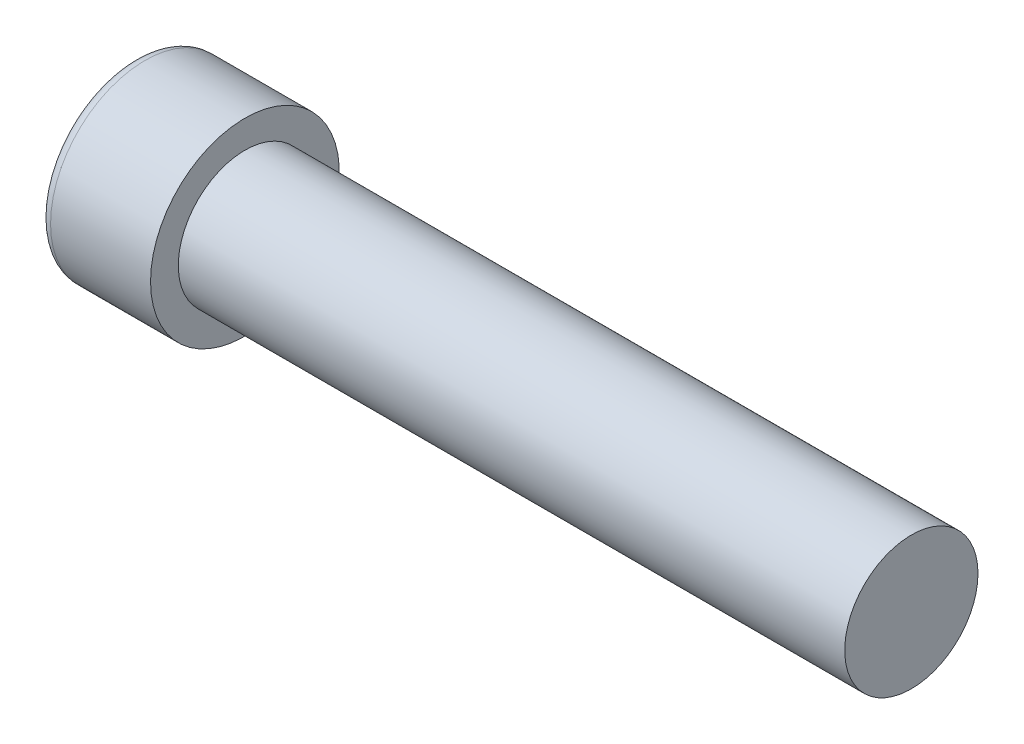
ISO-10303-21;
HEADER;
FILE_DESCRIPTION(('STEP AP214'),'2;1');
FILE_NAME('part.step','',(''),(''),'','','');
FILE_SCHEMA(('AUTOMOTIVE_DESIGN { 1 0 10303 214 1 1 1 1 }'));
ENDSEC;
DATA;
#1=APPLICATION_CONTEXT('core data for automotive mechanical design processes');
#2=APPLICATION_PROTOCOL_DEFINITION('international standard','automotive_design',2000,#1);
#3=PRODUCT_CONTEXT('',#1,'mechanical');
#4=PRODUCT('Part','Part','',(#3));
#5=PRODUCT_RELATED_PRODUCT_CATEGORY('part','',(#4));
#6=PRODUCT_DEFINITION_FORMATION('','',#4);
#7=PRODUCT_DEFINITION_CONTEXT('part definition',#1,'design');
#8=PRODUCT_DEFINITION('design','',#6,#7);
#9=PRODUCT_DEFINITION_SHAPE('','',#8);
#10=(LENGTH_UNIT() NAMED_UNIT(*) SI_UNIT(.MILLI.,.METRE.));
#11=(NAMED_UNIT(*) PLANE_ANGLE_UNIT() SI_UNIT($,.RADIAN.));
#12=(NAMED_UNIT(*) SI_UNIT($,.STERADIAN.) SOLID_ANGLE_UNIT());
#13=UNCERTAINTY_MEASURE_WITH_UNIT(LENGTH_MEASURE(1.E-05),#10,'distance_accuracy_value','');
#14=(GEOMETRIC_REPRESENTATION_CONTEXT(3) GLOBAL_UNCERTAINTY_ASSIGNED_CONTEXT((#13)) GLOBAL_UNIT_ASSIGNED_CONTEXT((#10,
#11,#12)) REPRESENTATION_CONTEXT('',''));
#15=CARTESIAN_POINT('',(0.,0.,0.));
#16=DIRECTION('',(0.,0.,1.));
#17=DIRECTION('',(1.,0.,0.));
#18=AXIS2_PLACEMENT_3D('',#15,#16,#17);
#19=CARTESIAN_POINT('',(-5.,2.,1.15470053837925));
#20=DIRECTION('',(0.,0.5,0.866025403784439));
#21=DIRECTION('',(1.,0.,0.));
#22=AXIS2_PLACEMENT_3D('',#19,#20,#21);
#23=PLANE('',#22);
#24=CARTESIAN_POINT('',(-5.00000000000303,2.00000000000525,1.15470053837622));
#25=CARTESIAN_POINT('',(-4.42264973080811,1.,1.73205080756888));
#26=CARTESIAN_POINT('',(-5.00000000000303,-5.2425236629762E-12,2.30940107676153));
#27=(BOUNDED_CURVE() B_SPLINE_CURVE(2,(#24,#25,#26),.UNSPECIFIED.,.F.,
.F.) B_SPLINE_CURVE_WITH_KNOTS((3,3),(0.13555018529598,0.453233872459208),
.UNSPECIFIED.) CURVE() GEOMETRIC_REPRESENTATION_ITEM() RATIONAL_B_SPLINE_CURVE((1.23205080756801,
1.42264973081124,1.23205080756801)) REPRESENTATION_ITEM(''));
#28=CARTESIAN_POINT('',(-5.,2.,1.15470053837925));
#29=VERTEX_POINT('',#28);
#30=CARTESIAN_POINT('',(-5.,0.,2.3094010767585));
#31=VERTEX_POINT('',#30);
#32=EDGE_CURVE('E178',#29,#31,#27,.T.);
#33=ORIENTED_EDGE('',*,*,#32,.F.);
#34=DIRECTION('',(1.,0.,0.));
#35=VECTOR('',#34,1.);
#36=CARTESIAN_POINT('',(-5.,2.,1.15470053837925));
#37=LINE('',#36,#35);
#38=CARTESIAN_POINT('',(-2.5,2.,1.15470053837925));
#39=VERTEX_POINT('',#38);
#40=EDGE_CURVE('E11',#29,#39,#37,.T.);
#41=ORIENTED_EDGE('',*,*,#40,.T.);
#42=CARTESIAN_POINT('',(-2.50000000000308,1.99999999999925,1.15470053837973));
#43=CARTESIAN_POINT('',(-2.1666666666702,1.00000000000002,1.73205080756892));
#44=CARTESIAN_POINT('',(-2.50000000000308,7.92049939540329E-13,2.3094010767581));
#45=(BOUNDED_CURVE() B_SPLINE_CURVE(2,(#42,#43,#44),.UNSPECIFIED.,.F.,
.F.) B_SPLINE_CURVE_WITH_KNOTS((3,3),(0.587240468873808,1.19731182874522),
.UNSPECIFIED.) CURVE() GEOMETRIC_REPRESENTATION_ITEM() RATIONAL_B_SPLINE_CURVE((2.40673326026348,
2.77905619136095,2.40673326026349)) REPRESENTATION_ITEM(''));
#46=CARTESIAN_POINT('',(-2.5,0.,2.3094010767585));
#47=VERTEX_POINT('',#46);
#48=EDGE_CURVE('E221',#39,#47,#45,.T.);
#49=ORIENTED_EDGE('',*,*,#48,.T.);
#50=DIRECTION('',(1.,0.,0.));
#51=VECTOR('',#50,1.);
#52=CARTESIAN_POINT('',(-5.,0.,2.3094010767585));
#53=LINE('',#52,#51);
#54=EDGE_CURVE('E142',#31,#47,#53,.T.);
#55=ORIENTED_EDGE('',*,*,#54,.F.);
#56=EDGE_LOOP('',(#33,#41,#49,#55));
#57=FACE_BOUND('',#56,.T.);
#58=ADVANCED_FACE('F17',(#57),#23,.F.);
#59=CARTESIAN_POINT('',(-5.,2.,-1.15470053837925));
#60=DIRECTION('',(0.,1.,0.));
#61=DIRECTION('',(1.,0.,0.));
#62=AXIS2_PLACEMENT_3D('',#59,#60,#61);
#63=PLANE('',#62);
#64=CARTESIAN_POINT('',(-5.00000000000303,2.,-1.15470053838531));
#65=CARTESIAN_POINT('',(-4.42264973080811,2.,0.));
#66=CARTESIAN_POINT('',(-5.00000000000303,2.,1.1547005383853));
#67=(BOUNDED_CURVE() B_SPLINE_CURVE(2,(#64,#65,#66),.UNSPECIFIED.,.F.,
.F.) B_SPLINE_CURVE_WITH_KNOTS((3,3),(0.13555018529598,0.453233872459208),
.UNSPECIFIED.) CURVE() GEOMETRIC_REPRESENTATION_ITEM() RATIONAL_B_SPLINE_CURVE((1.23205080756801,
1.42264973081124,1.23205080756801)) REPRESENTATION_ITEM(''));
#68=CARTESIAN_POINT('',(-5.,2.,-1.15470053837925));
#69=VERTEX_POINT('',#68);
#70=EDGE_CURVE('E172',#69,#29,#67,.T.);
#71=ORIENTED_EDGE('',*,*,#70,.F.);
#72=DIRECTION('',(1.,0.,0.));
#73=VECTOR('',#72,1.);
#74=CARTESIAN_POINT('',(-5.,2.,-1.15470053837925));
#75=LINE('',#74,#73);
#76=CARTESIAN_POINT('',(-2.5,2.,-1.15470053837925));
#77=VERTEX_POINT('',#76);
#78=EDGE_CURVE('E20',#69,#77,#75,.T.);
#79=ORIENTED_EDGE('',*,*,#78,.T.);
#80=CARTESIAN_POINT('',(-2.50000000000313,1.99999999999996,-1.15470053837835));
#81=CARTESIAN_POINT('',(-2.16666666667028,1.99999999999996,0.));
#82=CARTESIAN_POINT('',(-2.50000000000313,1.99999999999996,1.15470053837835));
#83=(BOUNDED_CURVE() B_SPLINE_CURVE(2,(#80,#81,#82),.UNSPECIFIED.,.F.,
.F.) B_SPLINE_CURVE_WITH_KNOTS((3,3),(0.587240468873821,1.19731182874517),
.UNSPECIFIED.) CURVE() GEOMETRIC_REPRESENTATION_ITEM() RATIONAL_B_SPLINE_CURVE((2.40673326026329,
2.77905619136064,2.40673326026329)) REPRESENTATION_ITEM(''));
#84=EDGE_CURVE('E212',#77,#39,#83,.T.);
#85=ORIENTED_EDGE('',*,*,#84,.T.);
#86=ORIENTED_EDGE('',*,*,#40,.F.);
#87=EDGE_LOOP('',(#71,#79,#85,#86));
#88=FACE_BOUND('',#87,.T.);
#89=ADVANCED_FACE('F357',(#88),#63,.F.);
#90=CARTESIAN_POINT('',(-5.,0.,-2.3094010767585));
#91=DIRECTION('',(0.,0.5,-0.866025403784439));
#92=DIRECTION('',(-1.,0.,0.));
#93=AXIS2_PLACEMENT_3D('',#90,#91,#92);
#94=PLANE('',#93);
#95=CARTESIAN_POINT('',(-5.00000000000303,-5.24608307864342E-12,-2.30940107676153));
#96=CARTESIAN_POINT('',(-4.4226497308081,0.999999999999997,-1.73205080756888));
#97=CARTESIAN_POINT('',(-5.00000000000303,2.00000000000524,-1.15470053837622));
#98=(BOUNDED_CURVE() B_SPLINE_CURVE(2,(#95,#96,#97),.UNSPECIFIED.,.F.,
.F.) B_SPLINE_CURVE_WITH_KNOTS((3,3),(0.13555018529598,0.453233872459209),
.UNSPECIFIED.) CURVE() GEOMETRIC_REPRESENTATION_ITEM() RATIONAL_B_SPLINE_CURVE((1.23205080756801,
1.42264973081124,1.23205080756801)) REPRESENTATION_ITEM(''));
#99=CARTESIAN_POINT('',(-5.,0.,-2.3094010767585));
#100=VERTEX_POINT('',#99);
#101=EDGE_CURVE('E179',#100,#69,#98,.T.);
#102=ORIENTED_EDGE('',*,*,#101,.F.);
#103=DIRECTION('',(1.,0.,0.));
#104=VECTOR('',#103,1.);
#105=CARTESIAN_POINT('',(-5.,0.,-2.3094010767585));
#106=LINE('',#105,#104);
#107=CARTESIAN_POINT('',(-2.5,0.,-2.3094010767585));
#108=VERTEX_POINT('',#107);
#109=EDGE_CURVE('E236',#100,#108,#106,.T.);
#110=ORIENTED_EDGE('',*,*,#109,.T.);
#111=CARTESIAN_POINT('',(-2.50000000000312,8.08010876004008E-13,-2.3094010767581));
#112=CARTESIAN_POINT('',(-2.16666666667028,1.00000000000001,-1.73205080756893));
#113=CARTESIAN_POINT('',(-2.50000000000315,1.99999999999924,-1.15470053837975));
#114=(BOUNDED_CURVE() B_SPLINE_CURVE(2,(#111,#112,#113),.UNSPECIFIED.,.F.,
.F.) B_SPLINE_CURVE_WITH_KNOTS((3,3),(0.587240468873836,1.19731182874522),
.UNSPECIFIED.) CURVE() GEOMETRIC_REPRESENTATION_ITEM() RATIONAL_B_SPLINE_CURVE((2.40673326026341,
2.7790561913608,2.4067332602634)) REPRESENTATION_ITEM(''));
#115=EDGE_CURVE('E220',#108,#77,#114,.T.);
#116=ORIENTED_EDGE('',*,*,#115,.T.);
#117=ORIENTED_EDGE('',*,*,#78,.F.);
#118=EDGE_LOOP('',(#102,#110,#116,#117));
#119=FACE_BOUND('',#118,.T.);
#120=ADVANCED_FACE('F351',(#119),#94,.F.);
#121=CARTESIAN_POINT('',(-5.,-2.,-1.15470053837925));
#122=DIRECTION('',(0.,-0.5,-0.866025403784439));
#123=DIRECTION('',(0.,-0.866025403784439,0.5));
#124=AXIS2_PLACEMENT_3D('',#121,#122,#123);
#125=PLANE('',#124);
#126=CARTESIAN_POINT('',(-5.00000000000303,-2.00000000000525,-1.15470053837622));
#127=CARTESIAN_POINT('',(-4.42264973080811,-1.,-1.73205080756888));
#128=CARTESIAN_POINT('',(-5.00000000000303,5.24207310403098E-12,-2.30940107676153));
#129=(BOUNDED_CURVE() B_SPLINE_CURVE(2,(#126,#127,#128),.UNSPECIFIED.,.F.,
.F.) B_SPLINE_CURVE_WITH_KNOTS((3,3),(0.13555018529598,0.453233872459208),
.UNSPECIFIED.) CURVE() GEOMETRIC_REPRESENTATION_ITEM() RATIONAL_B_SPLINE_CURVE((1.23205080756801,
1.42264973081124,1.23205080756801)) REPRESENTATION_ITEM(''));
#130=CARTESIAN_POINT('',(-5.,-2.,-1.15470053837925));
#131=VERTEX_POINT('',#130);
#132=EDGE_CURVE('E203',#131,#100,#129,.T.);
#133=ORIENTED_EDGE('',*,*,#132,.F.);
#134=DIRECTION('',(1.,0.,0.));
#135=VECTOR('',#134,1.);
#136=CARTESIAN_POINT('',(-5.,-2.,-1.15470053837925));
#137=LINE('',#136,#135);
#138=CARTESIAN_POINT('',(-2.5,-2.,-1.15470053837925));
#139=VERTEX_POINT('',#138);
#140=EDGE_CURVE('E230',#131,#139,#137,.T.);
#141=ORIENTED_EDGE('',*,*,#140,.T.);
#142=CARTESIAN_POINT('',(-2.50000000000308,-1.99999999999925,-1.15470053837973));
#143=CARTESIAN_POINT('',(-2.1666666666702,-1.00000000000002,-1.73205080756892));
#144=CARTESIAN_POINT('',(-2.50000000000307,-7.95555809977431E-13,-2.3094010767581));
#145=(BOUNDED_CURVE() B_SPLINE_CURVE(2,(#142,#143,#144),.UNSPECIFIED.,.F.,
.F.) B_SPLINE_CURVE_WITH_KNOTS((3,3),(0.587240468873808,1.19731182874522),
.UNSPECIFIED.) CURVE() GEOMETRIC_REPRESENTATION_ITEM() RATIONAL_B_SPLINE_CURVE((2.40673326026348,
2.77905619136095,2.40673326026349)) REPRESENTATION_ITEM(''));
#146=EDGE_CURVE('E241',#139,#108,#145,.T.);
#147=ORIENTED_EDGE('',*,*,#146,.T.);
#148=ORIENTED_EDGE('',*,*,#109,.F.);
#149=EDGE_LOOP('',(#133,#141,#147,#148));
#150=FACE_BOUND('',#149,.T.);
#151=ADVANCED_FACE('F356',(#150),#125,.F.);
#152=CARTESIAN_POINT('',(-5.,-2.,1.15470053837925));
#153=DIRECTION('',(0.,-1.,0.));
#154=DIRECTION('',(0.,0.,-1.));
#155=AXIS2_PLACEMENT_3D('',#152,#153,#154);
#156=PLANE('',#155);
#157=CARTESIAN_POINT('',(-5.00000000000303,-2.,1.15470053838531));
#158=CARTESIAN_POINT('',(-4.42264973080811,-2.,0.));
#159=CARTESIAN_POINT('',(-5.00000000000303,-2.,-1.1547005383853));
#160=(BOUNDED_CURVE() B_SPLINE_CURVE(2,(#157,#158,#159),.UNSPECIFIED.,.F.,
.F.) B_SPLINE_CURVE_WITH_KNOTS((3,3),(0.13555018529598,0.453233872459208),
.UNSPECIFIED.) CURVE() GEOMETRIC_REPRESENTATION_ITEM() RATIONAL_B_SPLINE_CURVE((1.23205080756801,
1.42264973081124,1.23205080756801)) REPRESENTATION_ITEM(''));
#161=CARTESIAN_POINT('',(-5.,-2.,1.15470053837925));
#162=VERTEX_POINT('',#161);
#163=EDGE_CURVE('E197',#162,#131,#160,.T.);
#164=ORIENTED_EDGE('',*,*,#163,.F.);
#165=DIRECTION('',(1.,0.,0.));
#166=VECTOR('',#165,1.);
#167=CARTESIAN_POINT('',(-5.,-2.,1.15470053837925));
#168=LINE('',#167,#166);
#169=CARTESIAN_POINT('',(-2.5,-2.,1.15470053837925));
#170=VERTEX_POINT('',#169);
#171=EDGE_CURVE('E134',#162,#170,#168,.T.);
#172=ORIENTED_EDGE('',*,*,#171,.T.);
#173=CARTESIAN_POINT('',(-2.50000000000313,-1.99999999999996,1.15470053837835));
#174=CARTESIAN_POINT('',(-2.16666666667028,-1.99999999999996,0.));
#175=CARTESIAN_POINT('',(-2.50000000000313,-1.99999999999996,-1.15470053837835));
#176=(BOUNDED_CURVE() B_SPLINE_CURVE(2,(#173,#174,#175),.UNSPECIFIED.,.F.,
.F.) B_SPLINE_CURVE_WITH_KNOTS((3,3),(0.587240468873821,1.19731182874517),
.UNSPECIFIED.) CURVE() GEOMETRIC_REPRESENTATION_ITEM() RATIONAL_B_SPLINE_CURVE((2.40673326026329,
2.77905619136064,2.40673326026329)) REPRESENTATION_ITEM(''));
#177=EDGE_CURVE('E250',#170,#139,#176,.T.);
#178=ORIENTED_EDGE('',*,*,#177,.T.);
#179=ORIENTED_EDGE('',*,*,#140,.F.);
#180=EDGE_LOOP('',(#164,#172,#178,#179));
#181=FACE_BOUND('',#180,.T.);
#182=ADVANCED_FACE('F384',(#181),#156,.F.);
#183=CARTESIAN_POINT('',(-501.166666666667,0.,0.));
#184=DIRECTION('',(-1.,0.,0.));
#185=DIRECTION('',(0.,0.,1.));
#186=AXIS2_PLACEMENT_3D('',#183,#184,#185);
#187=CONICAL_SURFACE('',#186,866.025403784438,1.0471975511966);
#188=CARTESIAN_POINT('',(-1.16666666666998,0.,0.));
#189=VERTEX_POINT('',#188);
#190=VERTEX_LOOP('',#189);
#191=FACE_BOUND('',#190,.T.);
#192=ORIENTED_EDGE('',*,*,#146,.F.);
#193=ORIENTED_EDGE('',*,*,#177,.F.);
#194=CARTESIAN_POINT('',(-2.50000000000312,-8.03951447076836E-13,2.3094010767581));
#195=CARTESIAN_POINT('',(-2.16666666667028,-1.00000000000001,1.73205080756893));
#196=CARTESIAN_POINT('',(-2.50000000000315,-1.99999999999924,1.15470053837975));
#197=(BOUNDED_CURVE() B_SPLINE_CURVE(2,(#194,#195,#196),.UNSPECIFIED.,.F.,
.F.) B_SPLINE_CURVE_WITH_KNOTS((3,3),(-1.19731182874521,-0.587240468873828),
.UNSPECIFIED.) CURVE() GEOMETRIC_REPRESENTATION_ITEM() RATIONAL_B_SPLINE_CURVE((2.40673326026341,
2.7790561913608,2.4067332602634)) REPRESENTATION_ITEM(''));
#198=EDGE_CURVE('E149',#47,#170,#197,.T.);
#199=ORIENTED_EDGE('',*,*,#198,.F.);
#200=ORIENTED_EDGE('',*,*,#48,.F.);
#201=ORIENTED_EDGE('',*,*,#84,.F.);
#202=ORIENTED_EDGE('',*,*,#115,.F.);
#203=EDGE_LOOP('',(#192,#193,#199,#200,#201,#202));
#204=FACE_BOUND('',#203,.T.);
#205=ADVANCED_FACE('F322',(#191,#204),#187,.F.);
#206=CARTESIAN_POINT('',(-5.,0.,0.));
#207=DIRECTION('',(-1.,0.,0.));
#208=DIRECTION('',(0.,0.,1.));
#209=AXIS2_PLACEMENT_3D('',#206,#207,#208);
#210=CONICAL_SURFACE('',#209,2.3094010767585,0.785398163397448);
#211=ORIENTED_EDGE('',*,*,#32,.T.);
#212=CARTESIAN_POINT('',(-5.,0.,0.));
#213=DIRECTION('',(1.,0.,0.));
#214=DIRECTION('',(0.,0.,-1.));
#215=AXIS2_PLACEMENT_3D('',#212,#213,#214);
#216=CIRCLE('',#215,2.3094010767585);
#217=EDGE_CURVE('E189',#29,#31,#216,.T.);
#218=ORIENTED_EDGE('',*,*,#217,.F.);
#219=EDGE_LOOP('',(#211,#218));
#220=FACE_BOUND('',#219,.T.);
#221=ADVANCED_FACE('F316',(#220),#210,.F.);
#222=CARTESIAN_POINT('',(-5.,0.,0.));
#223=DIRECTION('',(-1.,0.,0.));
#224=DIRECTION('',(0.,0.,1.));
#225=AXIS2_PLACEMENT_3D('',#222,#223,#224);
#226=CONICAL_SURFACE('',#225,2.3094010767585,0.785398163397448);
#227=ORIENTED_EDGE('',*,*,#70,.T.);
#228=CARTESIAN_POINT('',(-5.,0.,0.));
#229=DIRECTION('',(1.,0.,0.));
#230=DIRECTION('',(0.,0.,-1.));
#231=AXIS2_PLACEMENT_3D('',#228,#229,#230);
#232=CIRCLE('',#231,2.3094010767585);
#233=EDGE_CURVE('E128',#69,#29,#232,.T.);
#234=ORIENTED_EDGE('',*,*,#233,.F.);
#235=EDGE_LOOP('',(#227,#234));
#236=FACE_BOUND('',#235,.T.);
#237=ADVANCED_FACE('F321',(#236),#226,.F.);
#238=CARTESIAN_POINT('',(-5.,0.,0.));
#239=DIRECTION('',(-1.,0.,0.));
#240=DIRECTION('',(0.,0.,1.));
#241=AXIS2_PLACEMENT_3D('',#238,#239,#240);
#242=CONICAL_SURFACE('',#241,2.3094010767585,0.785398163397448);
#243=ORIENTED_EDGE('',*,*,#101,.T.);
#244=CARTESIAN_POINT('',(-5.,0.,0.));
#245=DIRECTION('',(1.,0.,0.));
#246=DIRECTION('',(0.,0.,-1.));
#247=AXIS2_PLACEMENT_3D('',#244,#245,#246);
#248=CIRCLE('',#247,2.3094010767585);
#249=EDGE_CURVE('E125',#100,#69,#248,.T.);
#250=ORIENTED_EDGE('',*,*,#249,.F.);
#251=EDGE_LOOP('',(#243,#250));
#252=FACE_BOUND('',#251,.T.);
#253=ADVANCED_FACE('F409',(#252),#242,.F.);
#254=CARTESIAN_POINT('',(-5.,0.,0.));
#255=DIRECTION('',(-1.,0.,0.));
#256=DIRECTION('',(0.,0.,1.));
#257=AXIS2_PLACEMENT_3D('',#254,#255,#256);
#258=CONICAL_SURFACE('',#257,2.3094010767585,0.785398163397448);
#259=ORIENTED_EDGE('',*,*,#132,.T.);
#260=CARTESIAN_POINT('',(-5.,0.,0.));
#261=DIRECTION('',(1.,0.,0.));
#262=DIRECTION('',(0.,0.,-1.));
#263=AXIS2_PLACEMENT_3D('',#260,#261,#262);
#264=CIRCLE('',#263,2.3094010767585);
#265=EDGE_CURVE('E129',#131,#100,#264,.T.);
#266=ORIENTED_EDGE('',*,*,#265,.F.);
#267=EDGE_LOOP('',(#259,#266));
#268=FACE_BOUND('',#267,.T.);
#269=ADVANCED_FACE('F393',(#268),#258,.F.);
#270=CARTESIAN_POINT('',(-5.,0.,0.));
#271=DIRECTION('',(-1.,0.,0.));
#272=DIRECTION('',(0.,0.,1.));
#273=AXIS2_PLACEMENT_3D('',#270,#271,#272);
#274=CONICAL_SURFACE('',#273,2.3094010767585,0.785398163397448);
#275=ORIENTED_EDGE('',*,*,#163,.T.);
#276=CARTESIAN_POINT('',(-5.,0.,0.));
#277=DIRECTION('',(1.,0.,0.));
#278=DIRECTION('',(0.,0.,-1.));
#279=AXIS2_PLACEMENT_3D('',#276,#277,#278);
#280=CIRCLE('',#279,2.3094010767585);
#281=EDGE_CURVE('E153',#162,#131,#280,.T.);
#282=ORIENTED_EDGE('',*,*,#281,.F.);
#283=EDGE_LOOP('',(#275,#282));
#284=FACE_BOUND('',#283,.T.);
#285=ADVANCED_FACE('F375',(#284),#274,.F.);
#286=CARTESIAN_POINT('',(-5.,0.,0.));
#287=DIRECTION('',(-1.,0.,0.));
#288=DIRECTION('',(0.,0.,1.));
#289=AXIS2_PLACEMENT_3D('',#286,#287,#288);
#290=CONICAL_SURFACE('',#289,2.3094010767585,0.785398163397448);
#291=CARTESIAN_POINT('',(-5.00000000000303,5.24482151359681E-12,2.30940107676153));
#292=CARTESIAN_POINT('',(-4.4226497308081,-1.,1.73205080756887));
#293=CARTESIAN_POINT('',(-5.00000000000303,-2.00000000000524,1.15470053837622));
#294=(BOUNDED_CURVE() B_SPLINE_CURVE(2,(#291,#292,#293),.UNSPECIFIED.,.F.,
.F.) B_SPLINE_CURVE_WITH_KNOTS((3,3),(-0.453233872459209,-0.13555018529598),
.UNSPECIFIED.) CURVE() GEOMETRIC_REPRESENTATION_ITEM() RATIONAL_B_SPLINE_CURVE((1.23205080756801,
1.42264973081124,1.23205080756801)) REPRESENTATION_ITEM(''));
#295=EDGE_CURVE('E136',#31,#162,#294,.T.);
#296=ORIENTED_EDGE('',*,*,#295,.T.);
#297=CARTESIAN_POINT('',(-5.,0.,0.));
#298=DIRECTION('',(1.,0.,0.));
#299=DIRECTION('',(0.,0.,-1.));
#300=AXIS2_PLACEMENT_3D('',#297,#298,#299);
#301=CIRCLE('',#300,2.3094010767585);
#302=EDGE_CURVE('E193',#31,#162,#301,.T.);
#303=ORIENTED_EDGE('',*,*,#302,.F.);
#304=EDGE_LOOP('',(#296,#303));
#305=FACE_BOUND('',#304,.T.);
#306=ADVANCED_FACE('F366',(#305),#290,.F.);
#307=CARTESIAN_POINT('',(-5.,2.3094010767585,0.));
#308=DIRECTION('',(1.,0.,0.));
#309=DIRECTION('',(0.,1.,0.));
#310=AXIS2_PLACEMENT_3D('',#307,#308,#309);
#311=PLANE('',#310);
#312=ORIENTED_EDGE('',*,*,#281,.T.);
#313=ORIENTED_EDGE('',*,*,#265,.T.);
#314=ORIENTED_EDGE('',*,*,#249,.T.);
#315=ORIENTED_EDGE('',*,*,#233,.T.);
#316=ORIENTED_EDGE('',*,*,#217,.T.);
#317=ORIENTED_EDGE('',*,*,#302,.T.);
#318=EDGE_LOOP('',(#312,#313,#314,#315,#316,#317));
#319=FACE_BOUND('',#318,.T.);
#320=CARTESIAN_POINT('',(-5.,0.,0.));
#321=DIRECTION('',(1.,0.,0.));
#322=DIRECTION('',(0.,0.,-1.));
#323=AXIS2_PLACEMENT_3D('',#320,#321,#322);
#324=CIRCLE('',#323,3.75);
#325=CARTESIAN_POINT('',(-5.,0.,3.75));
#326=VERTEX_POINT('',#325);
#327=EDGE_CURVE('E150',#326,#326,#324,.T.);
#328=ORIENTED_EDGE('',*,*,#327,.F.);
#329=EDGE_LOOP('',(#328));
#330=FACE_BOUND('',#329,.T.);
#331=ADVANCED_FACE('F301',(#319,#330),#311,.F.);
#332=CARTESIAN_POINT('',(-4.5,0.,0.));
#333=DIRECTION('',(1.,0.,0.));
#334=DIRECTION('',(0.,0.,-1.));
#335=AXIS2_PLACEMENT_3D('',#332,#333,#334);
#336=TOROIDAL_SURFACE('',#335,3.75,0.5);
#337=CARTESIAN_POINT('',(-4.5,0.,0.));
#338=DIRECTION('',(1.,0.,0.));
#339=DIRECTION('',(0.,0.,-1.));
#340=AXIS2_PLACEMENT_3D('',#337,#338,#339);
#341=CIRCLE('',#340,4.25);
#342=CARTESIAN_POINT('',(-4.5,0.,4.25));
#343=VERTEX_POINT('',#342);
#344=EDGE_CURVE('E133',#343,#343,#341,.T.);
#345=ORIENTED_EDGE('',*,*,#344,.F.);
#346=CARTESIAN_POINT('',(-4.5,0.,3.75));
#347=DIRECTION('',(0.,-1.,0.));
#348=DIRECTION('',(0.,0.,1.));
#349=AXIS2_PLACEMENT_3D('',#346,#347,#348);
#350=CIRCLE('',#349,0.5);
#351=EDGE_CURVE('E154',#343,#326,#350,.T.);
#352=ORIENTED_EDGE('',*,*,#351,.T.);
#353=ORIENTED_EDGE('',*,*,#327,.T.);
#354=ORIENTED_EDGE('',*,*,#351,.F.);
#355=EDGE_LOOP('',(#345,#352,#353,#354));
#356=FACE_BOUND('',#355,.T.);
#357=ADVANCED_FACE('F295',(#356),#336,.T.);
#358=CARTESIAN_POINT('',(30.,0.,0.));
#359=DIRECTION('',(-1.,0.,0.));
#360=DIRECTION('',(0.,0.,-1.));
#361=AXIS2_PLACEMENT_3D('',#358,#359,#360);
#362=CYLINDRICAL_SURFACE('',#361,4.25);
#363=ORIENTED_EDGE('',*,*,#344,.T.);
#364=DIRECTION('',(1.,0.,0.));
#365=VECTOR('',#364,1.);
#366=CARTESIAN_POINT('',(30.,0.,4.25));
#367=LINE('',#366,#365);
#368=CARTESIAN_POINT('',(0.,0.,4.25));
#369=VERTEX_POINT('',#368);
#370=EDGE_CURVE('E169',#343,#369,#367,.T.);
#371=ORIENTED_EDGE('',*,*,#370,.T.);
#372=CARTESIAN_POINT('',(0.,0.,0.));
#373=DIRECTION('',(1.,0.,0.));
#374=DIRECTION('',(0.,0.,-1.));
#375=AXIS2_PLACEMENT_3D('',#372,#373,#374);
#376=CIRCLE('',#375,4.25);
#377=EDGE_CURVE('E130',#369,#369,#376,.T.);
#378=ORIENTED_EDGE('',*,*,#377,.F.);
#379=ORIENTED_EDGE('',*,*,#370,.F.);
#380=EDGE_LOOP('',(#363,#371,#378,#379));
#381=FACE_BOUND('',#380,.T.);
#382=ADVANCED_FACE('F300',(#381),#362,.T.);
#383=CARTESIAN_POINT('',(0.,4.25,0.));
#384=DIRECTION('',(-1.,0.,0.));
#385=DIRECTION('',(0.,0.,1.));
#386=AXIS2_PLACEMENT_3D('',#383,#384,#385);
#387=PLANE('',#386);
#388=CARTESIAN_POINT('',(0.,0.,0.));
#389=DIRECTION('',(-1.,0.,0.));
#390=DIRECTION('',(0.,-4.07506797403534E-12,1.));
#391=AXIS2_PLACEMENT_3D('',#388,#389,#390);
#392=CIRCLE('',#391,3.);
#393=CARTESIAN_POINT('',(1.4210854715202E-13,1.22613030839602E-11,-3.));
#394=VERTEX_POINT('',#393);
#395=EDGE_CURVE('E112',#394,#394,#392,.T.);
#396=ORIENTED_EDGE('',*,*,#395,.T.);
#397=EDGE_LOOP('',(#396));
#398=FACE_BOUND('',#397,.T.);
#399=ORIENTED_EDGE('',*,*,#377,.T.);
#400=EDGE_LOOP('',(#399));
#401=FACE_BOUND('',#400,.T.);
#402=ADVANCED_FACE('F332',(#398,#401),#387,.F.);
#403=CARTESIAN_POINT('',(30.,2.0095,0.));
#404=DIRECTION('',(-1.,0.,0.));
#405=DIRECTION('',(0.,0.,1.));
#406=AXIS2_PLACEMENT_3D('',#403,#404,#405);
#407=PLANE('',#406);
#408=CARTESIAN_POINT('',(30.,0.,0.));
#409=DIRECTION('',(1.,0.,0.));
#410=DIRECTION('',(0.,-4.07506797403534E-12,1.));
#411=AXIS2_PLACEMENT_3D('',#408,#409,#410);
#412=CIRCLE('',#411,3.);
#413=CARTESIAN_POINT('',(30.,1.22624094305395E-11,-3.));
#414=VERTEX_POINT('',#413);
#415=EDGE_CURVE('E111',#414,#414,#412,.T.);
#416=ORIENTED_EDGE('',*,*,#415,.T.);
#417=EDGE_LOOP('',(#416));
#418=FACE_BOUND('',#417,.T.);
#419=ADVANCED_FACE('F116',(#418),#407,.F.);
#420=CARTESIAN_POINT('',(-5.,0.,2.3094010767585));
#421=DIRECTION('',(0.,-0.5,0.866025403784439));
#422=DIRECTION('',(-1.,0.,0.));
#423=AXIS2_PLACEMENT_3D('',#420,#421,#422);
#424=PLANE('',#423);
#425=ORIENTED_EDGE('',*,*,#295,.F.);
#426=ORIENTED_EDGE('',*,*,#54,.T.);
#427=ORIENTED_EDGE('',*,*,#198,.T.);
#428=ORIENTED_EDGE('',*,*,#171,.F.);
#429=EDGE_LOOP('',(#425,#426,#427,#428));
#430=FACE_BOUND('',#429,.T.);
#431=ADVANCED_FACE('F289',(#430),#424,.F.);
#432=CARTESIAN_POINT('',(1.4210854715202E-13,0.,0.));
#433=DIRECTION('',(1.,0.,0.));
#434=DIRECTION('',(0.,-4.07506797403534E-12,1.));
#435=AXIS2_PLACEMENT_3D('',#432,#433,#434);
#436=CYLINDRICAL_SURFACE('',#435,3.);
#437=ORIENTED_EDGE('',*,*,#415,.F.);
#438=DIRECTION('',(-1.,0.,0.));
#439=VECTOR('',#438,1.);
#440=CARTESIAN_POINT('',(1.41886502547095E-13,1.22610984529338E-11,-3.));
#441=LINE('',#440,#439);
#442=EDGE_CURVE('E108',#414,#394,#441,.T.);
#443=ORIENTED_EDGE('',*,*,#442,.T.);
#444=ORIENTED_EDGE('',*,*,#395,.F.);
#445=ORIENTED_EDGE('',*,*,#442,.F.);
#446=EDGE_LOOP('',(#437,#443,#444,#445));
#447=FACE_BOUND('',#446,.T.);
#448=ADVANCED_FACE('F110',(#447),#436,.T.);
#449=CLOSED_SHELL('',(#58,#89,#120,#151,#182,#205,#221,#237,#253,#269,#285,#306,#331,#357,#382,
#402,#419,#431,#448));
#450=MANIFOLD_SOLID_BREP('B1',#449);
#451=ADVANCED_BREP_SHAPE_REPRESENTATION('',(#18,#450),#14);
#452=SHAPE_DEFINITION_REPRESENTATION(#9,#451);
ENDSEC;
END-ISO-10303-21;
